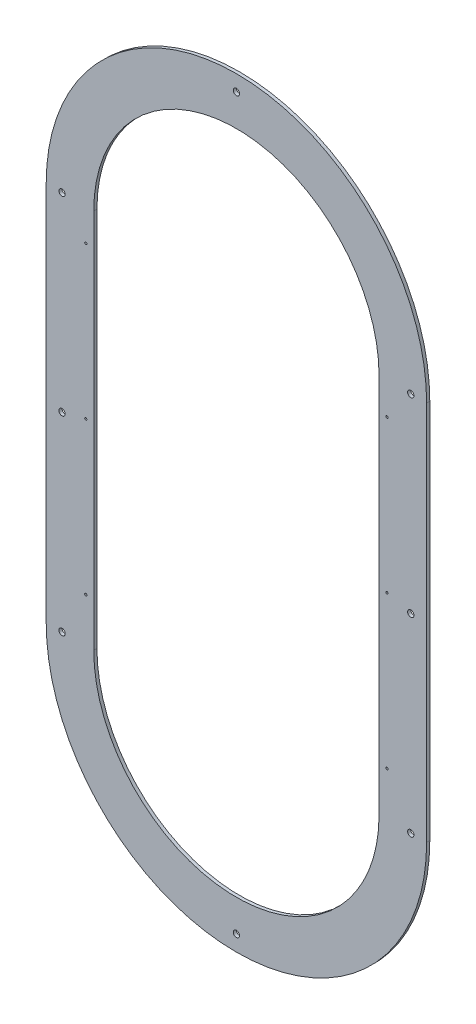
ISO-10303-21;
HEADER;
FILE_DESCRIPTION(('STEP AP214'),'2;1');
FILE_NAME('part.step','',(''),(''),'','','');
FILE_SCHEMA(('AUTOMOTIVE_DESIGN { 1 0 10303 214 1 1 1 1 }'));
ENDSEC;
DATA;
#1=APPLICATION_CONTEXT('core data for automotive mechanical design processes');
#2=APPLICATION_PROTOCOL_DEFINITION('international standard','automotive_design',2000,#1);
#3=PRODUCT_CONTEXT('',#1,'mechanical');
#4=PRODUCT('Part','Part','',(#3));
#5=PRODUCT_RELATED_PRODUCT_CATEGORY('part','',(#4));
#6=PRODUCT_DEFINITION_FORMATION('','',#4);
#7=PRODUCT_DEFINITION_CONTEXT('part definition',#1,'design');
#8=PRODUCT_DEFINITION('design','',#6,#7);
#9=PRODUCT_DEFINITION_SHAPE('','',#8);
#10=(LENGTH_UNIT() NAMED_UNIT(*) SI_UNIT(.MILLI.,.METRE.));
#11=(NAMED_UNIT(*) PLANE_ANGLE_UNIT() SI_UNIT($,.RADIAN.));
#12=(NAMED_UNIT(*) SI_UNIT($,.STERADIAN.) SOLID_ANGLE_UNIT());
#13=UNCERTAINTY_MEASURE_WITH_UNIT(LENGTH_MEASURE(1.E-05),#10,'distance_accuracy_value','');
#14=(GEOMETRIC_REPRESENTATION_CONTEXT(3) GLOBAL_UNCERTAINTY_ASSIGNED_CONTEXT((#13)) GLOBAL_UNIT_ASSIGNED_CONTEXT((#10,
#11,#12)) REPRESENTATION_CONTEXT('',''));
#15=CARTESIAN_POINT('',(0.,0.,0.));
#16=DIRECTION('',(0.,0.,1.));
#17=DIRECTION('',(1.,0.,0.));
#18=AXIS2_PLACEMENT_3D('',#15,#16,#17);
#19=CARTESIAN_POINT('',(0.,600.,0.));
#20=DIRECTION('',(0.,0.,1.));
#21=DIRECTION('',(1.,0.,0.));
#22=AXIS2_PLACEMENT_3D('',#19,#20,#21);
#23=PLANE('',#22);
#24=CARTESIAN_POINT('',(-475.,-460.750000000099,0.));
#25=DIRECTION('',(0.,0.,-1.));
#26=DIRECTION('',(-1.,0.,0.));
#27=AXIS2_PLACEMENT_3D('',#24,#25,#26);
#28=CIRCLE('',#27,3.5);
#29=CARTESIAN_POINT('',(-478.5,-460.750000000099,0.));
#30=VERTEX_POINT('',#29);
#31=EDGE_CURVE('E356',#30,#30,#28,.T.);
#32=ORIENTED_EDGE('',*,*,#31,.T.);
#33=EDGE_LOOP('',(#32));
#34=FACE_BOUND('',#33,.T.);
#35=CARTESIAN_POINT('',(474.999999999999,19.2499999999004,0.));
#36=DIRECTION('',(0.,0.,-1.));
#37=DIRECTION('',(-1.,0.,0.));
#38=AXIS2_PLACEMENT_3D('',#35,#36,#37);
#39=CIRCLE('',#38,3.5);
#40=CARTESIAN_POINT('',(471.499999999999,19.2499999999004,0.));
#41=VERTEX_POINT('',#40);
#42=EDGE_CURVE('E367',#41,#41,#39,.T.);
#43=ORIENTED_EDGE('',*,*,#42,.T.);
#44=EDGE_LOOP('',(#43));
#45=FACE_BOUND('',#44,.T.);
#46=CARTESIAN_POINT('',(474.999999999999,499.249999999901,0.));
#47=DIRECTION('',(0.,0.,-1.));
#48=DIRECTION('',(-1.,0.,0.));
#49=AXIS2_PLACEMENT_3D('',#46,#47,#48);
#50=CIRCLE('',#49,3.5);
#51=CARTESIAN_POINT('',(471.499999999999,499.249999999901,0.));
#52=VERTEX_POINT('',#51);
#53=EDGE_CURVE('E379',#52,#52,#50,.T.);
#54=ORIENTED_EDGE('',*,*,#53,.T.);
#55=EDGE_LOOP('',(#54));
#56=FACE_BOUND('',#55,.T.);
#57=CARTESIAN_POINT('',(475.,-460.750000000099,0.));
#58=DIRECTION('',(0.,0.,-1.));
#59=DIRECTION('',(-1.,0.,0.));
#60=AXIS2_PLACEMENT_3D('',#57,#58,#59);
#61=CIRCLE('',#60,3.5);
#62=CARTESIAN_POINT('',(471.5,-460.750000000099,0.));
#63=VERTEX_POINT('',#62);
#64=EDGE_CURVE('E391',#63,#63,#61,.T.);
#65=ORIENTED_EDGE('',*,*,#64,.T.);
#66=EDGE_LOOP('',(#65));
#67=FACE_BOUND('',#66,.T.);
#68=CARTESIAN_POINT('',(-1.01033360929657E-13,-1150.,0.));
#69=DIRECTION('',(0.,0.,1.));
#70=DIRECTION('',(1.,0.,0.));
#71=AXIS2_PLACEMENT_3D('',#68,#69,#70);
#72=CIRCLE('',#71,10.);
#73=CARTESIAN_POINT('',(9.9999999999999,-1150.,0.));
#74=VERTEX_POINT('',#73);
#75=EDGE_CURVE('E394',#74,#74,#72,.T.);
#76=ORIENTED_EDGE('',*,*,#75,.F.);
#77=EDGE_LOOP('',(#76));
#78=FACE_BOUND('',#77,.T.);
#79=CARTESIAN_POINT('',(550.,-600.,0.));
#80=DIRECTION('',(0.,0.,1.));
#81=DIRECTION('',(1.,0.,0.));
#82=AXIS2_PLACEMENT_3D('',#79,#80,#81);
#83=CIRCLE('',#82,9.99999999999998);
#84=CARTESIAN_POINT('',(560.,-600.,0.));
#85=VERTEX_POINT('',#84);
#86=EDGE_CURVE('E398',#85,#85,#83,.T.);
#87=ORIENTED_EDGE('',*,*,#86,.F.);
#88=EDGE_LOOP('',(#87));
#89=FACE_BOUND('',#88,.T.);
#90=CARTESIAN_POINT('',(550.,2.22044604925031E-13,0.));
#91=DIRECTION('',(0.,0.,1.));
#92=DIRECTION('',(1.,0.,0.));
#93=AXIS2_PLACEMENT_3D('',#90,#91,#92);
#94=CIRCLE('',#93,9.99999999999998);
#95=CARTESIAN_POINT('',(560.,2.22044604925031E-13,0.));
#96=VERTEX_POINT('',#95);
#97=EDGE_CURVE('E404',#96,#96,#94,.T.);
#98=ORIENTED_EDGE('',*,*,#97,.F.);
#99=EDGE_LOOP('',(#98));
#100=FACE_BOUND('',#99,.T.);
#101=CARTESIAN_POINT('',(550.,600.,0.));
#102=DIRECTION('',(0.,0.,1.));
#103=DIRECTION('',(1.,0.,0.));
#104=AXIS2_PLACEMENT_3D('',#101,#102,#103);
#105=CIRCLE('',#104,9.99999999999998);
#106=CARTESIAN_POINT('',(560.,600.,0.));
#107=VERTEX_POINT('',#106);
#108=EDGE_CURVE('E410',#107,#107,#105,.T.);
#109=ORIENTED_EDGE('',*,*,#108,.F.);
#110=EDGE_LOOP('',(#109));
#111=FACE_BOUND('',#110,.T.);
#112=CARTESIAN_POINT('',(-550.,-600.,0.));
#113=DIRECTION('',(0.,0.,1.));
#114=DIRECTION('',(1.,0.,0.));
#115=AXIS2_PLACEMENT_3D('',#112,#113,#114);
#116=CIRCLE('',#115,9.99999999999998);
#117=CARTESIAN_POINT('',(-540.,-600.,0.));
#118=VERTEX_POINT('',#117);
#119=EDGE_CURVE('E416',#118,#118,#116,.T.);
#120=ORIENTED_EDGE('',*,*,#119,.F.);
#121=EDGE_LOOP('',(#120));
#122=FACE_BOUND('',#121,.T.);
#123=CARTESIAN_POINT('',(-550.,1.11022302462516E-13,0.));
#124=DIRECTION('',(0.,0.,1.));
#125=DIRECTION('',(1.,0.,0.));
#126=AXIS2_PLACEMENT_3D('',#123,#124,#125);
#127=CIRCLE('',#126,9.99999999999998);
#128=CARTESIAN_POINT('',(-540.,1.11022302462516E-13,0.));
#129=VERTEX_POINT('',#128);
#130=EDGE_CURVE('E422',#129,#129,#127,.T.);
#131=ORIENTED_EDGE('',*,*,#130,.F.);
#132=EDGE_LOOP('',(#131));
#133=FACE_BOUND('',#132,.T.);
#134=CARTESIAN_POINT('',(-550.,600.,0.));
#135=DIRECTION('',(0.,0.,1.));
#136=DIRECTION('',(1.,0.,0.));
#137=AXIS2_PLACEMENT_3D('',#134,#135,#136);
#138=CIRCLE('',#137,9.99999999999998);
#139=CARTESIAN_POINT('',(-540.,600.,0.));
#140=VERTEX_POINT('',#139);
#141=EDGE_CURVE('E428',#140,#140,#138,.T.);
#142=ORIENTED_EDGE('',*,*,#141,.F.);
#143=EDGE_LOOP('',(#142));
#144=FACE_BOUND('',#143,.T.);
#145=CARTESIAN_POINT('',(0.,1150.,0.));
#146=DIRECTION('',(0.,0.,1.));
#147=DIRECTION('',(1.,0.,0.));
#148=AXIS2_PLACEMENT_3D('',#145,#146,#147);
#149=CIRCLE('',#148,10.);
#150=CARTESIAN_POINT('',(10.,1150.,0.));
#151=VERTEX_POINT('',#150);
#152=EDGE_CURVE('E126',#151,#151,#149,.T.);
#153=ORIENTED_EDGE('',*,*,#152,.F.);
#154=EDGE_LOOP('',(#153));
#155=FACE_BOUND('',#154,.T.);
#156=CARTESIAN_POINT('',(0.,-600.,0.));
#157=DIRECTION('',(0.,0.,1.));
#158=DIRECTION('',(1.,0.,0.));
#159=AXIS2_PLACEMENT_3D('',#156,#157,#158);
#160=CIRCLE('',#159,450.);
#161=CARTESIAN_POINT('',(-450.,-600.,0.));
#162=VERTEX_POINT('',#161);
#163=CARTESIAN_POINT('',(450.,-600.,0.));
#164=VERTEX_POINT('',#163);
#165=EDGE_CURVE('E61',#162,#164,#160,.T.);
#166=ORIENTED_EDGE('',*,*,#165,.F.);
#167=DIRECTION('',(0.,-1.,0.));
#168=VECTOR('',#167,1.);
#169=CARTESIAN_POINT('',(-450.,-600.,0.));
#170=LINE('',#169,#168);
#171=CARTESIAN_POINT('',(-450.,600.,0.));
#172=VERTEX_POINT('',#171);
#173=EDGE_CURVE('E120',#172,#162,#170,.T.);
#174=ORIENTED_EDGE('',*,*,#173,.F.);
#175=CARTESIAN_POINT('',(0.,600.,0.));
#176=DIRECTION('',(0.,0.,1.));
#177=DIRECTION('',(1.,0.,0.));
#178=AXIS2_PLACEMENT_3D('',#175,#176,#177);
#179=CIRCLE('',#178,450.);
#180=CARTESIAN_POINT('',(450.,600.,0.));
#181=VERTEX_POINT('',#180);
#182=EDGE_CURVE('E123',#181,#172,#179,.T.);
#183=ORIENTED_EDGE('',*,*,#182,.F.);
#184=DIRECTION('',(0.,1.,0.));
#185=VECTOR('',#184,1.);
#186=CARTESIAN_POINT('',(450.,-600.,0.));
#187=LINE('',#186,#185);
#188=EDGE_CURVE('E132',#164,#181,#187,.T.);
#189=ORIENTED_EDGE('',*,*,#188,.F.);
#190=EDGE_LOOP('',(#166,#174,#183,#189));
#191=FACE_BOUND('',#190,.T.);
#192=CARTESIAN_POINT('',(0.,600.,0.));
#193=DIRECTION('',(0.,0.,1.));
#194=DIRECTION('',(1.,0.,0.));
#195=AXIS2_PLACEMENT_3D('',#192,#193,#194);
#196=CIRCLE('',#195,600.);
#197=CARTESIAN_POINT('',(600.,600.,0.));
#198=VERTEX_POINT('',#197);
#199=CARTESIAN_POINT('',(-600.,600.,0.));
#200=VERTEX_POINT('',#199);
#201=EDGE_CURVE('E139',#198,#200,#196,.T.);
#202=ORIENTED_EDGE('',*,*,#201,.T.);
#203=DIRECTION('',(0.,-1.,0.));
#204=VECTOR('',#203,1.);
#205=CARTESIAN_POINT('',(-600.,-600.,0.));
#206=LINE('',#205,#204);
#207=CARTESIAN_POINT('',(-600.,-600.,0.));
#208=VERTEX_POINT('',#207);
#209=EDGE_CURVE('E158',#200,#208,#206,.T.);
#210=ORIENTED_EDGE('',*,*,#209,.T.);
#211=CARTESIAN_POINT('',(0.,-600.,0.));
#212=DIRECTION('',(0.,0.,1.));
#213=DIRECTION('',(1.,0.,0.));
#214=AXIS2_PLACEMENT_3D('',#211,#212,#213);
#215=CIRCLE('',#214,600.);
#216=CARTESIAN_POINT('',(600.,-600.,0.));
#217=VERTEX_POINT('',#216);
#218=EDGE_CURVE('E161',#208,#217,#215,.T.);
#219=ORIENTED_EDGE('',*,*,#218,.T.);
#220=DIRECTION('',(0.,1.,0.));
#221=VECTOR('',#220,1.);
#222=CARTESIAN_POINT('',(600.,-600.,0.));
#223=LINE('',#222,#221);
#224=EDGE_CURVE('E147',#217,#198,#223,.T.);
#225=ORIENTED_EDGE('',*,*,#224,.T.);
#226=EDGE_LOOP('',(#202,#210,#219,#225));
#227=FACE_BOUND('',#226,.T.);
#228=CARTESIAN_POINT('',(-474.999999999999,499.249999999901,0.));
#229=DIRECTION('',(0.,0.,-1.));
#230=DIRECTION('',(-1.,0.,0.));
#231=AXIS2_PLACEMENT_3D('',#228,#229,#230);
#232=CIRCLE('',#231,3.5);
#233=CARTESIAN_POINT('',(-478.499999999999,499.249999999901,0.));
#234=VERTEX_POINT('',#233);
#235=EDGE_CURVE('E344',#234,#234,#232,.T.);
#236=ORIENTED_EDGE('',*,*,#235,.T.);
#237=EDGE_LOOP('',(#236));
#238=FACE_BOUND('',#237,.T.);
#239=CARTESIAN_POINT('',(-474.999999999999,19.2499999999004,0.));
#240=DIRECTION('',(0.,0.,-1.));
#241=DIRECTION('',(-1.,0.,0.));
#242=AXIS2_PLACEMENT_3D('',#239,#240,#241);
#243=CIRCLE('',#242,3.5);
#244=CARTESIAN_POINT('',(-478.499999999999,19.2499999999004,0.));
#245=VERTEX_POINT('',#244);
#246=EDGE_CURVE('E332',#245,#245,#243,.T.);
#247=ORIENTED_EDGE('',*,*,#246,.T.);
#248=EDGE_LOOP('',(#247));
#249=FACE_BOUND('',#248,.T.);
#250=ADVANCED_FACE('F36',(#34,#45,#56,#67,#78,#89,#100,#111,#122,#133,#144,#155,#191,#227,#238,
#249),#23,.T.);
#251=CARTESIAN_POINT('',(0.,600.,-10.));
#252=DIRECTION('',(0.,0.,1.));
#253=DIRECTION('',(1.,0.,0.));
#254=AXIS2_PLACEMENT_3D('',#251,#252,#253);
#255=CYLINDRICAL_SURFACE('',#254,600.);
#256=ORIENTED_EDGE('',*,*,#201,.F.);
#257=DIRECTION('',(0.,0.,1.));
#258=VECTOR('',#257,1.);
#259=CARTESIAN_POINT('',(600.,600.,-10.));
#260=LINE('',#259,#258);
#261=CARTESIAN_POINT('',(600.,600.,-10.));
#262=VERTEX_POINT('',#261);
#263=EDGE_CURVE('E11',#262,#198,#260,.T.);
#264=ORIENTED_EDGE('',*,*,#263,.F.);
#265=CARTESIAN_POINT('',(0.,600.,-10.));
#266=DIRECTION('',(0.,0.,1.));
#267=DIRECTION('',(1.,0.,0.));
#268=AXIS2_PLACEMENT_3D('',#265,#266,#267);
#269=CIRCLE('',#268,600.);
#270=CARTESIAN_POINT('',(-600.,600.,-10.));
#271=VERTEX_POINT('',#270);
#272=EDGE_CURVE('E143',#262,#271,#269,.T.);
#273=ORIENTED_EDGE('',*,*,#272,.T.);
#274=DIRECTION('',(0.,0.,1.));
#275=VECTOR('',#274,1.);
#276=CARTESIAN_POINT('',(-600.,600.,-10.));
#277=LINE('',#276,#275);
#278=EDGE_CURVE('E40',#271,#200,#277,.T.);
#279=ORIENTED_EDGE('',*,*,#278,.T.);
#280=EDGE_LOOP('',(#256,#264,#273,#279));
#281=FACE_BOUND('',#280,.T.);
#282=ADVANCED_FACE('F38',(#281),#255,.T.);
#283=CARTESIAN_POINT('',(600.,-600.,-10.));
#284=DIRECTION('',(1.,0.,0.));
#285=DIRECTION('',(0.,0.,-1.));
#286=AXIS2_PLACEMENT_3D('',#283,#284,#285);
#287=PLANE('',#286);
#288=ORIENTED_EDGE('',*,*,#224,.F.);
#289=DIRECTION('',(0.,0.,1.));
#290=VECTOR('',#289,1.);
#291=CARTESIAN_POINT('',(600.,-600.,-10.));
#292=LINE('',#291,#290);
#293=CARTESIAN_POINT('',(600.,-600.,-10.));
#294=VERTEX_POINT('',#293);
#295=EDGE_CURVE('E45',#294,#217,#292,.T.);
#296=ORIENTED_EDGE('',*,*,#295,.F.);
#297=DIRECTION('',(0.,1.,0.));
#298=VECTOR('',#297,1.);
#299=CARTESIAN_POINT('',(600.,-600.,-10.));
#300=LINE('',#299,#298);
#301=EDGE_CURVE('E153',#294,#262,#300,.T.);
#302=ORIENTED_EDGE('',*,*,#301,.T.);
#303=ORIENTED_EDGE('',*,*,#263,.T.);
#304=EDGE_LOOP('',(#288,#296,#302,#303));
#305=FACE_BOUND('',#304,.T.);
#306=ADVANCED_FACE('F179',(#305),#287,.T.);
#307=CARTESIAN_POINT('',(0.,-600.,-10.));
#308=DIRECTION('',(0.,0.,1.));
#309=DIRECTION('',(1.,0.,0.));
#310=AXIS2_PLACEMENT_3D('',#307,#308,#309);
#311=CYLINDRICAL_SURFACE('',#310,600.);
#312=ORIENTED_EDGE('',*,*,#218,.F.);
#313=DIRECTION('',(0.,0.,1.));
#314=VECTOR('',#313,1.);
#315=CARTESIAN_POINT('',(-600.,-600.,-10.));
#316=LINE('',#315,#314);
#317=CARTESIAN_POINT('',(-600.,-600.,-10.));
#318=VERTEX_POINT('',#317);
#319=EDGE_CURVE('E166',#318,#208,#316,.T.);
#320=ORIENTED_EDGE('',*,*,#319,.F.);
#321=CARTESIAN_POINT('',(0.,-600.,-10.));
#322=DIRECTION('',(0.,0.,1.));
#323=DIRECTION('',(1.,0.,0.));
#324=AXIS2_PLACEMENT_3D('',#321,#322,#323);
#325=CIRCLE('',#324,600.);
#326=EDGE_CURVE('E150',#318,#294,#325,.T.);
#327=ORIENTED_EDGE('',*,*,#326,.T.);
#328=ORIENTED_EDGE('',*,*,#295,.T.);
#329=EDGE_LOOP('',(#312,#320,#327,#328));
#330=FACE_BOUND('',#329,.T.);
#331=ADVANCED_FACE('F183',(#330),#311,.T.);
#332=CARTESIAN_POINT('',(-600.,-600.,-10.));
#333=DIRECTION('',(-1.,0.,0.));
#334=DIRECTION('',(0.,0.,1.));
#335=AXIS2_PLACEMENT_3D('',#332,#333,#334);
#336=PLANE('',#335);
#337=ORIENTED_EDGE('',*,*,#209,.F.);
#338=ORIENTED_EDGE('',*,*,#278,.F.);
#339=DIRECTION('',(0.,-1.,0.));
#340=VECTOR('',#339,1.);
#341=CARTESIAN_POINT('',(-600.,-600.,-10.));
#342=LINE('',#341,#340);
#343=EDGE_CURVE('E146',#271,#318,#342,.T.);
#344=ORIENTED_EDGE('',*,*,#343,.T.);
#345=ORIENTED_EDGE('',*,*,#319,.T.);
#346=EDGE_LOOP('',(#337,#338,#344,#345));
#347=FACE_BOUND('',#346,.T.);
#348=ADVANCED_FACE('F174',(#347),#336,.T.);
#349=CARTESIAN_POINT('',(0.,600.,-10.));
#350=DIRECTION('',(0.,0.,1.));
#351=DIRECTION('',(1.,0.,0.));
#352=AXIS2_PLACEMENT_3D('',#349,#350,#351);
#353=PLANE('',#352);
#354=CARTESIAN_POINT('',(-474.999999999999,19.2499999999004,-10.));
#355=DIRECTION('',(0.,0.,-1.));
#356=DIRECTION('',(-1.,0.,0.));
#357=AXIS2_PLACEMENT_3D('',#354,#355,#356);
#358=CIRCLE('',#357,5.);
#359=CARTESIAN_POINT('',(-479.999999999999,19.2499999999004,-10.));
#360=VERTEX_POINT('',#359);
#361=EDGE_CURVE('E325',#360,#360,#358,.T.);
#362=ORIENTED_EDGE('',*,*,#361,.F.);
#363=EDGE_LOOP('',(#362));
#364=FACE_BOUND('',#363,.T.);
#365=CARTESIAN_POINT('',(-474.999999999999,499.249999999901,-10.));
#366=DIRECTION('',(0.,0.,-1.));
#367=DIRECTION('',(-1.,0.,0.));
#368=AXIS2_PLACEMENT_3D('',#365,#366,#367);
#369=CIRCLE('',#368,5.);
#370=CARTESIAN_POINT('',(-479.999999999999,499.249999999901,-10.));
#371=VERTEX_POINT('',#370);
#372=EDGE_CURVE('E335',#371,#371,#369,.T.);
#373=ORIENTED_EDGE('',*,*,#372,.F.);
#374=EDGE_LOOP('',(#373));
#375=FACE_BOUND('',#374,.T.);
#376=CARTESIAN_POINT('',(-475.,-460.750000000099,-10.));
#377=DIRECTION('',(0.,0.,-1.));
#378=DIRECTION('',(-1.,0.,0.));
#379=AXIS2_PLACEMENT_3D('',#376,#377,#378);
#380=CIRCLE('',#379,5.);
#381=CARTESIAN_POINT('',(-480.,-460.750000000099,-10.));
#382=VERTEX_POINT('',#381);
#383=EDGE_CURVE('E347',#382,#382,#380,.T.);
#384=ORIENTED_EDGE('',*,*,#383,.F.);
#385=EDGE_LOOP('',(#384));
#386=FACE_BOUND('',#385,.T.);
#387=CARTESIAN_POINT('',(474.999999999999,19.2499999999004,-10.));
#388=DIRECTION('',(0.,0.,-1.));
#389=DIRECTION('',(-1.,0.,0.));
#390=AXIS2_PLACEMENT_3D('',#387,#388,#389);
#391=CIRCLE('',#390,5.);
#392=CARTESIAN_POINT('',(469.999999999999,19.2499999999004,-10.));
#393=VERTEX_POINT('',#392);
#394=EDGE_CURVE('E358',#393,#393,#391,.T.);
#395=ORIENTED_EDGE('',*,*,#394,.F.);
#396=EDGE_LOOP('',(#395));
#397=FACE_BOUND('',#396,.T.);
#398=CARTESIAN_POINT('',(474.999999999999,499.249999999901,-10.));
#399=DIRECTION('',(0.,0.,-1.));
#400=DIRECTION('',(-1.,0.,0.));
#401=AXIS2_PLACEMENT_3D('',#398,#399,#400);
#402=CIRCLE('',#401,5.);
#403=CARTESIAN_POINT('',(469.999999999999,499.249999999901,-10.));
#404=VERTEX_POINT('',#403);
#405=EDGE_CURVE('E370',#404,#404,#402,.T.);
#406=ORIENTED_EDGE('',*,*,#405,.F.);
#407=EDGE_LOOP('',(#406));
#408=FACE_BOUND('',#407,.T.);
#409=CARTESIAN_POINT('',(475.,-460.750000000099,-10.));
#410=DIRECTION('',(0.,0.,-1.));
#411=DIRECTION('',(-1.,0.,0.));
#412=AXIS2_PLACEMENT_3D('',#409,#410,#411);
#413=CIRCLE('',#412,5.);
#414=CARTESIAN_POINT('',(470.,-460.750000000099,-10.));
#415=VERTEX_POINT('',#414);
#416=EDGE_CURVE('E382',#415,#415,#413,.T.);
#417=ORIENTED_EDGE('',*,*,#416,.F.);
#418=EDGE_LOOP('',(#417));
#419=FACE_BOUND('',#418,.T.);
#420=CARTESIAN_POINT('',(-1.01033360929657E-13,-1150.,-10.));
#421=DIRECTION('',(0.,0.,1.));
#422=DIRECTION('',(1.,0.,0.));
#423=AXIS2_PLACEMENT_3D('',#420,#421,#422);
#424=CIRCLE('',#423,10.);
#425=CARTESIAN_POINT('',(9.9999999999999,-1150.,-10.));
#426=VERTEX_POINT('',#425);
#427=EDGE_CURVE('E395',#426,#426,#424,.T.);
#428=ORIENTED_EDGE('',*,*,#427,.T.);
#429=EDGE_LOOP('',(#428));
#430=FACE_BOUND('',#429,.T.);
#431=CARTESIAN_POINT('',(550.,-600.,-10.));
#432=DIRECTION('',(0.,0.,1.));
#433=DIRECTION('',(1.,0.,0.));
#434=AXIS2_PLACEMENT_3D('',#431,#432,#433);
#435=CIRCLE('',#434,9.99999999999998);
#436=CARTESIAN_POINT('',(560.,-600.,-10.));
#437=VERTEX_POINT('',#436);
#438=EDGE_CURVE('E401',#437,#437,#435,.T.);
#439=ORIENTED_EDGE('',*,*,#438,.T.);
#440=EDGE_LOOP('',(#439));
#441=FACE_BOUND('',#440,.T.);
#442=CARTESIAN_POINT('',(550.,2.22044604925031E-13,-10.));
#443=DIRECTION('',(0.,0.,1.));
#444=DIRECTION('',(1.,0.,0.));
#445=AXIS2_PLACEMENT_3D('',#442,#443,#444);
#446=CIRCLE('',#445,9.99999999999998);
#447=CARTESIAN_POINT('',(560.,2.22044604925031E-13,-10.));
#448=VERTEX_POINT('',#447);
#449=EDGE_CURVE('E407',#448,#448,#446,.T.);
#450=ORIENTED_EDGE('',*,*,#449,.T.);
#451=EDGE_LOOP('',(#450));
#452=FACE_BOUND('',#451,.T.);
#453=CARTESIAN_POINT('',(550.,600.,-10.));
#454=DIRECTION('',(0.,0.,1.));
#455=DIRECTION('',(1.,0.,0.));
#456=AXIS2_PLACEMENT_3D('',#453,#454,#455);
#457=CIRCLE('',#456,9.99999999999998);
#458=CARTESIAN_POINT('',(560.,600.,-10.));
#459=VERTEX_POINT('',#458);
#460=EDGE_CURVE('E413',#459,#459,#457,.T.);
#461=ORIENTED_EDGE('',*,*,#460,.T.);
#462=EDGE_LOOP('',(#461));
#463=FACE_BOUND('',#462,.T.);
#464=CARTESIAN_POINT('',(-550.,-600.,-10.));
#465=DIRECTION('',(0.,0.,1.));
#466=DIRECTION('',(1.,0.,0.));
#467=AXIS2_PLACEMENT_3D('',#464,#465,#466);
#468=CIRCLE('',#467,9.99999999999998);
#469=CARTESIAN_POINT('',(-540.,-600.,-10.));
#470=VERTEX_POINT('',#469);
#471=EDGE_CURVE('E419',#470,#470,#468,.T.);
#472=ORIENTED_EDGE('',*,*,#471,.T.);
#473=EDGE_LOOP('',(#472));
#474=FACE_BOUND('',#473,.T.);
#475=CARTESIAN_POINT('',(-550.,1.11022302462516E-13,-10.));
#476=DIRECTION('',(0.,0.,1.));
#477=DIRECTION('',(1.,0.,0.));
#478=AXIS2_PLACEMENT_3D('',#475,#476,#477);
#479=CIRCLE('',#478,9.99999999999998);
#480=CARTESIAN_POINT('',(-540.,1.11022302462516E-13,-10.));
#481=VERTEX_POINT('',#480);
#482=EDGE_CURVE('E425',#481,#481,#479,.T.);
#483=ORIENTED_EDGE('',*,*,#482,.T.);
#484=EDGE_LOOP('',(#483));
#485=FACE_BOUND('',#484,.T.);
#486=CARTESIAN_POINT('',(-550.,600.,-10.));
#487=DIRECTION('',(0.,0.,1.));
#488=DIRECTION('',(1.,0.,0.));
#489=AXIS2_PLACEMENT_3D('',#486,#487,#488);
#490=CIRCLE('',#489,9.99999999999998);
#491=CARTESIAN_POINT('',(-540.,600.,-10.));
#492=VERTEX_POINT('',#491);
#493=EDGE_CURVE('E431',#492,#492,#490,.T.);
#494=ORIENTED_EDGE('',*,*,#493,.T.);
#495=EDGE_LOOP('',(#494));
#496=FACE_BOUND('',#495,.T.);
#497=CARTESIAN_POINT('',(0.,1150.,-10.));
#498=DIRECTION('',(0.,0.,1.));
#499=DIRECTION('',(1.,0.,0.));
#500=AXIS2_PLACEMENT_3D('',#497,#498,#499);
#501=CIRCLE('',#500,10.);
#502=CARTESIAN_POINT('',(10.,1150.,-10.));
#503=VERTEX_POINT('',#502);
#504=EDGE_CURVE('E133',#503,#503,#501,.T.);
#505=ORIENTED_EDGE('',*,*,#504,.T.);
#506=EDGE_LOOP('',(#505));
#507=FACE_BOUND('',#506,.T.);
#508=DIRECTION('',(0.,-1.,0.));
#509=VECTOR('',#508,1.);
#510=CARTESIAN_POINT('',(-450.,-600.,-10.));
#511=LINE('',#510,#509);
#512=CARTESIAN_POINT('',(-450.,600.,-10.));
#513=VERTEX_POINT('',#512);
#514=CARTESIAN_POINT('',(-450.,-600.,-10.));
#515=VERTEX_POINT('',#514);
#516=EDGE_CURVE('E110',#513,#515,#511,.T.);
#517=ORIENTED_EDGE('',*,*,#516,.T.);
#518=CARTESIAN_POINT('',(0.,-600.,-10.));
#519=DIRECTION('',(0.,0.,1.));
#520=DIRECTION('',(1.,0.,0.));
#521=AXIS2_PLACEMENT_3D('',#518,#519,#520);
#522=CIRCLE('',#521,450.);
#523=CARTESIAN_POINT('',(450.,-600.,-10.));
#524=VERTEX_POINT('',#523);
#525=EDGE_CURVE('E104',#515,#524,#522,.T.);
#526=ORIENTED_EDGE('',*,*,#525,.T.);
#527=DIRECTION('',(0.,1.,0.));
#528=VECTOR('',#527,1.);
#529=CARTESIAN_POINT('',(450.,-600.,-10.));
#530=LINE('',#529,#528);
#531=CARTESIAN_POINT('',(450.,600.,-10.));
#532=VERTEX_POINT('',#531);
#533=EDGE_CURVE('E113',#524,#532,#530,.T.);
#534=ORIENTED_EDGE('',*,*,#533,.T.);
#535=CARTESIAN_POINT('',(0.,600.,-10.));
#536=DIRECTION('',(0.,0.,1.));
#537=DIRECTION('',(1.,0.,0.));
#538=AXIS2_PLACEMENT_3D('',#535,#536,#537);
#539=CIRCLE('',#538,450.);
#540=EDGE_CURVE('E53',#532,#513,#539,.T.);
#541=ORIENTED_EDGE('',*,*,#540,.T.);
#542=EDGE_LOOP('',(#517,#526,#534,#541));
#543=FACE_BOUND('',#542,.T.);
#544=ORIENTED_EDGE('',*,*,#272,.F.);
#545=ORIENTED_EDGE('',*,*,#301,.F.);
#546=ORIENTED_EDGE('',*,*,#326,.F.);
#547=ORIENTED_EDGE('',*,*,#343,.F.);
#548=EDGE_LOOP('',(#544,#545,#546,#547));
#549=FACE_BOUND('',#548,.T.);
#550=ADVANCED_FACE('F117',(#364,#375,#386,#397,#408,#419,#430,#441,#452,#463,#474,#485,#496,
#507,#543,#549),#353,.F.);
#551=CARTESIAN_POINT('',(0.,-600.,-10.));
#552=DIRECTION('',(0.,0.,1.));
#553=DIRECTION('',(1.,0.,0.));
#554=AXIS2_PLACEMENT_3D('',#551,#552,#553);
#555=CYLINDRICAL_SURFACE('',#554,450.);
#556=ORIENTED_EDGE('',*,*,#165,.T.);
#557=DIRECTION('',(0.,0.,1.));
#558=VECTOR('',#557,1.);
#559=CARTESIAN_POINT('',(450.,-600.,-10.));
#560=LINE('',#559,#558);
#561=EDGE_CURVE('E100',#524,#164,#560,.T.);
#562=ORIENTED_EDGE('',*,*,#561,.F.);
#563=ORIENTED_EDGE('',*,*,#525,.F.);
#564=DIRECTION('',(0.,0.,1.));
#565=VECTOR('',#564,1.);
#566=CARTESIAN_POINT('',(-450.,-600.,-10.));
#567=LINE('',#566,#565);
#568=EDGE_CURVE('E137',#515,#162,#567,.T.);
#569=ORIENTED_EDGE('',*,*,#568,.T.);
#570=EDGE_LOOP('',(#556,#562,#563,#569));
#571=FACE_BOUND('',#570,.T.);
#572=ADVANCED_FACE('F102',(#571),#555,.F.);
#573=CARTESIAN_POINT('',(-450.,-600.,-10.));
#574=DIRECTION('',(-1.,0.,0.));
#575=DIRECTION('',(0.,0.,1.));
#576=AXIS2_PLACEMENT_3D('',#573,#574,#575);
#577=PLANE('',#576);
#578=ORIENTED_EDGE('',*,*,#173,.T.);
#579=ORIENTED_EDGE('',*,*,#568,.F.);
#580=ORIENTED_EDGE('',*,*,#516,.F.);
#581=DIRECTION('',(0.,0.,1.));
#582=VECTOR('',#581,1.);
#583=CARTESIAN_POINT('',(-450.,600.,-10.));
#584=LINE('',#583,#582);
#585=EDGE_CURVE('E140',#513,#172,#584,.T.);
#586=ORIENTED_EDGE('',*,*,#585,.T.);
#587=EDGE_LOOP('',(#578,#579,#580,#586));
#588=FACE_BOUND('',#587,.T.);
#589=ADVANCED_FACE('F205',(#588),#577,.F.);
#590=CARTESIAN_POINT('',(0.,600.,-10.));
#591=DIRECTION('',(0.,0.,1.));
#592=DIRECTION('',(1.,0.,0.));
#593=AXIS2_PLACEMENT_3D('',#590,#591,#592);
#594=CYLINDRICAL_SURFACE('',#593,450.);
#595=ORIENTED_EDGE('',*,*,#182,.T.);
#596=ORIENTED_EDGE('',*,*,#585,.F.);
#597=ORIENTED_EDGE('',*,*,#540,.F.);
#598=DIRECTION('',(0.,0.,1.));
#599=VECTOR('',#598,1.);
#600=CARTESIAN_POINT('',(450.,600.,-10.));
#601=LINE('',#600,#599);
#602=EDGE_CURVE('E109',#532,#181,#601,.T.);
#603=ORIENTED_EDGE('',*,*,#602,.T.);
#604=EDGE_LOOP('',(#595,#596,#597,#603));
#605=FACE_BOUND('',#604,.T.);
#606=ADVANCED_FACE('F209',(#605),#594,.F.);
#607=CARTESIAN_POINT('',(450.,-600.,-10.));
#608=DIRECTION('',(1.,0.,0.));
#609=DIRECTION('',(0.,0.,-1.));
#610=AXIS2_PLACEMENT_3D('',#607,#608,#609);
#611=PLANE('',#610);
#612=ORIENTED_EDGE('',*,*,#188,.T.);
#613=ORIENTED_EDGE('',*,*,#602,.F.);
#614=ORIENTED_EDGE('',*,*,#533,.F.);
#615=ORIENTED_EDGE('',*,*,#561,.T.);
#616=EDGE_LOOP('',(#612,#613,#614,#615));
#617=FACE_BOUND('',#616,.T.);
#618=ADVANCED_FACE('F114',(#617),#611,.F.);
#619=CARTESIAN_POINT('',(0.,1150.,-10.));
#620=DIRECTION('',(0.,0.,1.));
#621=DIRECTION('',(1.,0.,0.));
#622=AXIS2_PLACEMENT_3D('',#619,#620,#621);
#623=CYLINDRICAL_SURFACE('',#622,10.);
#624=ORIENTED_EDGE('',*,*,#504,.F.);
#625=EDGE_LOOP('',(#624));
#626=FACE_BOUND('',#625,.T.);
#627=ORIENTED_EDGE('',*,*,#152,.T.);
#628=EDGE_LOOP('',(#627));
#629=FACE_BOUND('',#628,.T.);
#630=ADVANCED_FACE('F208',(#626,#629),#623,.F.);
#631=CARTESIAN_POINT('',(-550.,600.,-10.));
#632=DIRECTION('',(0.,0.,1.));
#633=DIRECTION('',(1.,0.,0.));
#634=AXIS2_PLACEMENT_3D('',#631,#632,#633);
#635=CYLINDRICAL_SURFACE('',#634,9.99999999999998);
#636=ORIENTED_EDGE('',*,*,#493,.F.);
#637=EDGE_LOOP('',(#636));
#638=FACE_BOUND('',#637,.T.);
#639=ORIENTED_EDGE('',*,*,#141,.T.);
#640=EDGE_LOOP('',(#639));
#641=FACE_BOUND('',#640,.T.);
#642=ADVANCED_FACE('F217',(#638,#641),#635,.F.);
#643=CARTESIAN_POINT('',(-550.,1.11022302462516E-13,-10.));
#644=DIRECTION('',(0.,0.,1.));
#645=DIRECTION('',(1.,0.,0.));
#646=AXIS2_PLACEMENT_3D('',#643,#644,#645);
#647=CYLINDRICAL_SURFACE('',#646,9.99999999999998);
#648=ORIENTED_EDGE('',*,*,#482,.F.);
#649=EDGE_LOOP('',(#648));
#650=FACE_BOUND('',#649,.T.);
#651=ORIENTED_EDGE('',*,*,#130,.T.);
#652=EDGE_LOOP('',(#651));
#653=FACE_BOUND('',#652,.T.);
#654=ADVANCED_FACE('F221',(#650,#653),#647,.F.);
#655=CARTESIAN_POINT('',(-550.,-600.,-10.));
#656=DIRECTION('',(0.,0.,1.));
#657=DIRECTION('',(1.,0.,0.));
#658=AXIS2_PLACEMENT_3D('',#655,#656,#657);
#659=CYLINDRICAL_SURFACE('',#658,9.99999999999998);
#660=ORIENTED_EDGE('',*,*,#471,.F.);
#661=EDGE_LOOP('',(#660));
#662=FACE_BOUND('',#661,.T.);
#663=ORIENTED_EDGE('',*,*,#119,.T.);
#664=EDGE_LOOP('',(#663));
#665=FACE_BOUND('',#664,.T.);
#666=ADVANCED_FACE('F225',(#662,#665),#659,.F.);
#667=CARTESIAN_POINT('',(550.,600.,-10.));
#668=DIRECTION('',(0.,0.,1.));
#669=DIRECTION('',(1.,0.,0.));
#670=AXIS2_PLACEMENT_3D('',#667,#668,#669);
#671=CYLINDRICAL_SURFACE('',#670,9.99999999999998);
#672=ORIENTED_EDGE('',*,*,#460,.F.);
#673=EDGE_LOOP('',(#672));
#674=FACE_BOUND('',#673,.T.);
#675=ORIENTED_EDGE('',*,*,#108,.T.);
#676=EDGE_LOOP('',(#675));
#677=FACE_BOUND('',#676,.T.);
#678=ADVANCED_FACE('F229',(#674,#677),#671,.F.);
#679=CARTESIAN_POINT('',(550.,2.22044604925031E-13,-10.));
#680=DIRECTION('',(0.,0.,1.));
#681=DIRECTION('',(1.,0.,0.));
#682=AXIS2_PLACEMENT_3D('',#679,#680,#681);
#683=CYLINDRICAL_SURFACE('',#682,9.99999999999998);
#684=ORIENTED_EDGE('',*,*,#449,.F.);
#685=EDGE_LOOP('',(#684));
#686=FACE_BOUND('',#685,.T.);
#687=ORIENTED_EDGE('',*,*,#97,.T.);
#688=EDGE_LOOP('',(#687));
#689=FACE_BOUND('',#688,.T.);
#690=ADVANCED_FACE('F233',(#686,#689),#683,.F.);
#691=CARTESIAN_POINT('',(550.,-600.,-10.));
#692=DIRECTION('',(0.,0.,1.));
#693=DIRECTION('',(1.,0.,0.));
#694=AXIS2_PLACEMENT_3D('',#691,#692,#693);
#695=CYLINDRICAL_SURFACE('',#694,9.99999999999998);
#696=ORIENTED_EDGE('',*,*,#438,.F.);
#697=EDGE_LOOP('',(#696));
#698=FACE_BOUND('',#697,.T.);
#699=ORIENTED_EDGE('',*,*,#86,.T.);
#700=EDGE_LOOP('',(#699));
#701=FACE_BOUND('',#700,.T.);
#702=ADVANCED_FACE('F237',(#698,#701),#695,.F.);
#703=CARTESIAN_POINT('',(-1.01033360929657E-13,-1150.,-10.));
#704=DIRECTION('',(0.,0.,1.));
#705=DIRECTION('',(1.,0.,0.));
#706=AXIS2_PLACEMENT_3D('',#703,#704,#705);
#707=CYLINDRICAL_SURFACE('',#706,10.);
#708=ORIENTED_EDGE('',*,*,#427,.F.);
#709=EDGE_LOOP('',(#708));
#710=FACE_BOUND('',#709,.T.);
#711=ORIENTED_EDGE('',*,*,#75,.T.);
#712=EDGE_LOOP('',(#711));
#713=FACE_BOUND('',#712,.T.);
#714=ADVANCED_FACE('F241',(#710,#713),#707,.F.);
#715=CARTESIAN_POINT('',(475.,-460.750000000099,-10.));
#716=DIRECTION('',(0.,0.,-1.));
#717=DIRECTION('',(-1.,0.,0.));
#718=AXIS2_PLACEMENT_3D('',#715,#716,#717);
#719=CYLINDRICAL_SURFACE('',#718,3.5);
#720=ORIENTED_EDGE('',*,*,#64,.F.);
#721=EDGE_LOOP('',(#720));
#722=FACE_BOUND('',#721,.T.);
#723=CARTESIAN_POINT('',(475.,-460.750000000099,-5.));
#724=DIRECTION('',(0.,0.,-1.));
#725=DIRECTION('',(-1.,0.,0.));
#726=AXIS2_PLACEMENT_3D('',#723,#724,#725);
#727=CIRCLE('',#726,3.5);
#728=CARTESIAN_POINT('',(471.5,-460.750000000099,-5.));
#729=VERTEX_POINT('',#728);
#730=EDGE_CURVE('E388',#729,#729,#727,.T.);
#731=ORIENTED_EDGE('',*,*,#730,.T.);
#732=EDGE_LOOP('',(#731));
#733=FACE_BOUND('',#732,.T.);
#734=ADVANCED_FACE('F245',(#722,#733),#719,.F.);
#735=CARTESIAN_POINT('',(478.5,-460.750000000099,-5.));
#736=DIRECTION('',(0.,0.,1.));
#737=DIRECTION('',(1.,0.,0.));
#738=AXIS2_PLACEMENT_3D('',#735,#736,#737);
#739=PLANE('',#738);
#740=ORIENTED_EDGE('',*,*,#730,.F.);
#741=EDGE_LOOP('',(#740));
#742=FACE_BOUND('',#741,.T.);
#743=CARTESIAN_POINT('',(475.,-460.750000000099,-5.));
#744=DIRECTION('',(0.,0.,-1.));
#745=DIRECTION('',(-1.,0.,0.));
#746=AXIS2_PLACEMENT_3D('',#743,#744,#745);
#747=CIRCLE('',#746,5.);
#748=CARTESIAN_POINT('',(470.,-460.750000000099,-5.));
#749=VERTEX_POINT('',#748);
#750=EDGE_CURVE('E385',#749,#749,#747,.T.);
#751=ORIENTED_EDGE('',*,*,#750,.T.);
#752=EDGE_LOOP('',(#751));
#753=FACE_BOUND('',#752,.T.);
#754=ADVANCED_FACE('F249',(#742,#753),#739,.F.);
#755=CARTESIAN_POINT('',(475.,-460.750000000099,-10.));
#756=DIRECTION('',(0.,0.,-1.));
#757=DIRECTION('',(-1.,0.,0.));
#758=AXIS2_PLACEMENT_3D('',#755,#756,#757);
#759=CYLINDRICAL_SURFACE('',#758,5.);
#760=ORIENTED_EDGE('',*,*,#750,.F.);
#761=EDGE_LOOP('',(#760));
#762=FACE_BOUND('',#761,.T.);
#763=ORIENTED_EDGE('',*,*,#416,.T.);
#764=EDGE_LOOP('',(#763));
#765=FACE_BOUND('',#764,.T.);
#766=ADVANCED_FACE('F253',(#762,#765),#759,.F.);
#767=CARTESIAN_POINT('',(474.999999999999,499.249999999901,-10.));
#768=DIRECTION('',(0.,0.,-1.));
#769=DIRECTION('',(-1.,0.,0.));
#770=AXIS2_PLACEMENT_3D('',#767,#768,#769);
#771=CYLINDRICAL_SURFACE('',#770,3.5);
#772=ORIENTED_EDGE('',*,*,#53,.F.);
#773=EDGE_LOOP('',(#772));
#774=FACE_BOUND('',#773,.T.);
#775=CARTESIAN_POINT('',(474.999999999999,499.249999999901,-5.));
#776=DIRECTION('',(0.,0.,-1.));
#777=DIRECTION('',(-1.,0.,0.));
#778=AXIS2_PLACEMENT_3D('',#775,#776,#777);
#779=CIRCLE('',#778,3.5);
#780=CARTESIAN_POINT('',(471.499999999999,499.249999999901,-5.));
#781=VERTEX_POINT('',#780);
#782=EDGE_CURVE('E376',#781,#781,#779,.T.);
#783=ORIENTED_EDGE('',*,*,#782,.T.);
#784=EDGE_LOOP('',(#783));
#785=FACE_BOUND('',#784,.T.);
#786=ADVANCED_FACE('F257',(#774,#785),#771,.F.);
#787=CARTESIAN_POINT('',(478.499999999999,499.249999999901,-5.));
#788=DIRECTION('',(0.,0.,1.));
#789=DIRECTION('',(1.,0.,0.));
#790=AXIS2_PLACEMENT_3D('',#787,#788,#789);
#791=PLANE('',#790);
#792=ORIENTED_EDGE('',*,*,#782,.F.);
#793=EDGE_LOOP('',(#792));
#794=FACE_BOUND('',#793,.T.);
#795=CARTESIAN_POINT('',(474.999999999999,499.249999999901,-5.));
#796=DIRECTION('',(0.,0.,-1.));
#797=DIRECTION('',(-1.,0.,0.));
#798=AXIS2_PLACEMENT_3D('',#795,#796,#797);
#799=CIRCLE('',#798,5.);
#800=CARTESIAN_POINT('',(469.999999999999,499.249999999901,-5.));
#801=VERTEX_POINT('',#800);
#802=EDGE_CURVE('E373',#801,#801,#799,.T.);
#803=ORIENTED_EDGE('',*,*,#802,.T.);
#804=EDGE_LOOP('',(#803));
#805=FACE_BOUND('',#804,.T.);
#806=ADVANCED_FACE('F261',(#794,#805),#791,.F.);
#807=CARTESIAN_POINT('',(474.999999999999,499.249999999901,-10.));
#808=DIRECTION('',(0.,0.,-1.));
#809=DIRECTION('',(-1.,0.,0.));
#810=AXIS2_PLACEMENT_3D('',#807,#808,#809);
#811=CYLINDRICAL_SURFACE('',#810,5.);
#812=ORIENTED_EDGE('',*,*,#802,.F.);
#813=EDGE_LOOP('',(#812));
#814=FACE_BOUND('',#813,.T.);
#815=ORIENTED_EDGE('',*,*,#405,.T.);
#816=EDGE_LOOP('',(#815));
#817=FACE_BOUND('',#816,.T.);
#818=ADVANCED_FACE('F265',(#814,#817),#811,.F.);
#819=CARTESIAN_POINT('',(474.999999999999,19.2499999999004,-10.));
#820=DIRECTION('',(0.,0.,-1.));
#821=DIRECTION('',(-1.,0.,0.));
#822=AXIS2_PLACEMENT_3D('',#819,#820,#821);
#823=CYLINDRICAL_SURFACE('',#822,3.5);
#824=ORIENTED_EDGE('',*,*,#42,.F.);
#825=EDGE_LOOP('',(#824));
#826=FACE_BOUND('',#825,.T.);
#827=CARTESIAN_POINT('',(474.999999999999,19.2499999999004,-5.));
#828=DIRECTION('',(0.,0.,-1.));
#829=DIRECTION('',(-1.,0.,0.));
#830=AXIS2_PLACEMENT_3D('',#827,#828,#829);
#831=CIRCLE('',#830,3.5);
#832=CARTESIAN_POINT('',(471.499999999999,19.2499999999004,-5.));
#833=VERTEX_POINT('',#832);
#834=EDGE_CURVE('E364',#833,#833,#831,.T.);
#835=ORIENTED_EDGE('',*,*,#834,.T.);
#836=EDGE_LOOP('',(#835));
#837=FACE_BOUND('',#836,.T.);
#838=ADVANCED_FACE('F269',(#826,#837),#823,.F.);
#839=CARTESIAN_POINT('',(478.499999999999,19.2499999999004,-5.));
#840=DIRECTION('',(0.,0.,1.));
#841=DIRECTION('',(1.,0.,0.));
#842=AXIS2_PLACEMENT_3D('',#839,#840,#841);
#843=PLANE('',#842);
#844=ORIENTED_EDGE('',*,*,#834,.F.);
#845=EDGE_LOOP('',(#844));
#846=FACE_BOUND('',#845,.T.);
#847=CARTESIAN_POINT('',(474.999999999999,19.2499999999004,-5.));
#848=DIRECTION('',(0.,0.,-1.));
#849=DIRECTION('',(-1.,0.,0.));
#850=AXIS2_PLACEMENT_3D('',#847,#848,#849);
#851=CIRCLE('',#850,5.);
#852=CARTESIAN_POINT('',(469.999999999999,19.2499999999004,-5.));
#853=VERTEX_POINT('',#852);
#854=EDGE_CURVE('E361',#853,#853,#851,.T.);
#855=ORIENTED_EDGE('',*,*,#854,.T.);
#856=EDGE_LOOP('',(#855));
#857=FACE_BOUND('',#856,.T.);
#858=ADVANCED_FACE('F273',(#846,#857),#843,.F.);
#859=CARTESIAN_POINT('',(474.999999999999,19.2499999999004,-10.));
#860=DIRECTION('',(0.,0.,-1.));
#861=DIRECTION('',(-1.,0.,0.));
#862=AXIS2_PLACEMENT_3D('',#859,#860,#861);
#863=CYLINDRICAL_SURFACE('',#862,5.);
#864=ORIENTED_EDGE('',*,*,#854,.F.);
#865=EDGE_LOOP('',(#864));
#866=FACE_BOUND('',#865,.T.);
#867=ORIENTED_EDGE('',*,*,#394,.T.);
#868=EDGE_LOOP('',(#867));
#869=FACE_BOUND('',#868,.T.);
#870=ADVANCED_FACE('F277',(#866,#869),#863,.F.);
#871=CARTESIAN_POINT('',(-475.,-460.750000000099,-10.));
#872=DIRECTION('',(0.,0.,-1.));
#873=DIRECTION('',(-1.,0.,0.));
#874=AXIS2_PLACEMENT_3D('',#871,#872,#873);
#875=CYLINDRICAL_SURFACE('',#874,3.5);
#876=ORIENTED_EDGE('',*,*,#31,.F.);
#877=EDGE_LOOP('',(#876));
#878=FACE_BOUND('',#877,.T.);
#879=CARTESIAN_POINT('',(-475.,-460.750000000099,-5.));
#880=DIRECTION('',(0.,0.,-1.));
#881=DIRECTION('',(-1.,0.,0.));
#882=AXIS2_PLACEMENT_3D('',#879,#880,#881);
#883=CIRCLE('',#882,3.5);
#884=CARTESIAN_POINT('',(-478.5,-460.750000000099,-5.));
#885=VERTEX_POINT('',#884);
#886=EDGE_CURVE('E353',#885,#885,#883,.T.);
#887=ORIENTED_EDGE('',*,*,#886,.T.);
#888=EDGE_LOOP('',(#887));
#889=FACE_BOUND('',#888,.T.);
#890=ADVANCED_FACE('F281',(#878,#889),#875,.F.);
#891=CARTESIAN_POINT('',(-471.5,-460.750000000099,-5.));
#892=DIRECTION('',(0.,0.,1.));
#893=DIRECTION('',(1.,0.,0.));
#894=AXIS2_PLACEMENT_3D('',#891,#892,#893);
#895=PLANE('',#894);
#896=ORIENTED_EDGE('',*,*,#886,.F.);
#897=EDGE_LOOP('',(#896));
#898=FACE_BOUND('',#897,.T.);
#899=CARTESIAN_POINT('',(-475.,-460.750000000099,-5.));
#900=DIRECTION('',(0.,0.,-1.));
#901=DIRECTION('',(-1.,0.,0.));
#902=AXIS2_PLACEMENT_3D('',#899,#900,#901);
#903=CIRCLE('',#902,5.);
#904=CARTESIAN_POINT('',(-480.,-460.750000000099,-5.));
#905=VERTEX_POINT('',#904);
#906=EDGE_CURVE('E350',#905,#905,#903,.T.);
#907=ORIENTED_EDGE('',*,*,#906,.T.);
#908=EDGE_LOOP('',(#907));
#909=FACE_BOUND('',#908,.T.);
#910=ADVANCED_FACE('F285',(#898,#909),#895,.F.);
#911=CARTESIAN_POINT('',(-475.,-460.750000000099,-10.));
#912=DIRECTION('',(0.,0.,-1.));
#913=DIRECTION('',(-1.,0.,0.));
#914=AXIS2_PLACEMENT_3D('',#911,#912,#913);
#915=CYLINDRICAL_SURFACE('',#914,5.);
#916=ORIENTED_EDGE('',*,*,#906,.F.);
#917=EDGE_LOOP('',(#916));
#918=FACE_BOUND('',#917,.T.);
#919=ORIENTED_EDGE('',*,*,#383,.T.);
#920=EDGE_LOOP('',(#919));
#921=FACE_BOUND('',#920,.T.);
#922=ADVANCED_FACE('F289',(#918,#921),#915,.F.);
#923=CARTESIAN_POINT('',(-474.999999999999,499.249999999901,-10.));
#924=DIRECTION('',(0.,0.,-1.));
#925=DIRECTION('',(-1.,0.,0.));
#926=AXIS2_PLACEMENT_3D('',#923,#924,#925);
#927=CYLINDRICAL_SURFACE('',#926,3.5);
#928=ORIENTED_EDGE('',*,*,#235,.F.);
#929=EDGE_LOOP('',(#928));
#930=FACE_BOUND('',#929,.T.);
#931=CARTESIAN_POINT('',(-474.999999999999,499.249999999901,-5.));
#932=DIRECTION('',(0.,0.,-1.));
#933=DIRECTION('',(-1.,0.,0.));
#934=AXIS2_PLACEMENT_3D('',#931,#932,#933);
#935=CIRCLE('',#934,3.5);
#936=CARTESIAN_POINT('',(-478.499999999999,499.249999999901,-5.));
#937=VERTEX_POINT('',#936);
#938=EDGE_CURVE('E341',#937,#937,#935,.T.);
#939=ORIENTED_EDGE('',*,*,#938,.T.);
#940=EDGE_LOOP('',(#939));
#941=FACE_BOUND('',#940,.T.);
#942=ADVANCED_FACE('F293',(#930,#941),#927,.F.);
#943=CARTESIAN_POINT('',(-471.499999999999,499.249999999901,-5.));
#944=DIRECTION('',(0.,0.,1.));
#945=DIRECTION('',(1.,0.,0.));
#946=AXIS2_PLACEMENT_3D('',#943,#944,#945);
#947=PLANE('',#946);
#948=ORIENTED_EDGE('',*,*,#938,.F.);
#949=EDGE_LOOP('',(#948));
#950=FACE_BOUND('',#949,.T.);
#951=CARTESIAN_POINT('',(-474.999999999999,499.249999999901,-5.));
#952=DIRECTION('',(0.,0.,-1.));
#953=DIRECTION('',(-1.,0.,0.));
#954=AXIS2_PLACEMENT_3D('',#951,#952,#953);
#955=CIRCLE('',#954,5.);
#956=CARTESIAN_POINT('',(-479.999999999999,499.249999999901,-5.));
#957=VERTEX_POINT('',#956);
#958=EDGE_CURVE('E338',#957,#957,#955,.T.);
#959=ORIENTED_EDGE('',*,*,#958,.T.);
#960=EDGE_LOOP('',(#959));
#961=FACE_BOUND('',#960,.T.);
#962=ADVANCED_FACE('F297',(#950,#961),#947,.F.);
#963=CARTESIAN_POINT('',(-474.999999999999,499.249999999901,-10.));
#964=DIRECTION('',(0.,0.,-1.));
#965=DIRECTION('',(-1.,0.,0.));
#966=AXIS2_PLACEMENT_3D('',#963,#964,#965);
#967=CYLINDRICAL_SURFACE('',#966,5.);
#968=ORIENTED_EDGE('',*,*,#958,.F.);
#969=EDGE_LOOP('',(#968));
#970=FACE_BOUND('',#969,.T.);
#971=ORIENTED_EDGE('',*,*,#372,.T.);
#972=EDGE_LOOP('',(#971));
#973=FACE_BOUND('',#972,.T.);
#974=ADVANCED_FACE('F301',(#970,#973),#967,.F.);
#975=CARTESIAN_POINT('',(-474.999999999999,19.2499999999004,-10.));
#976=DIRECTION('',(0.,0.,-1.));
#977=DIRECTION('',(-1.,0.,0.));
#978=AXIS2_PLACEMENT_3D('',#975,#976,#977);
#979=CYLINDRICAL_SURFACE('',#978,3.5);
#980=ORIENTED_EDGE('',*,*,#246,.F.);
#981=EDGE_LOOP('',(#980));
#982=FACE_BOUND('',#981,.T.);
#983=CARTESIAN_POINT('',(-474.999999999999,19.2499999999004,-5.));
#984=DIRECTION('',(0.,0.,-1.));
#985=DIRECTION('',(-1.,0.,0.));
#986=AXIS2_PLACEMENT_3D('',#983,#984,#985);
#987=CIRCLE('',#986,3.5);
#988=CARTESIAN_POINT('',(-478.499999999999,19.2499999999004,-5.));
#989=VERTEX_POINT('',#988);
#990=EDGE_CURVE('E327',#989,#989,#987,.T.);
#991=ORIENTED_EDGE('',*,*,#990,.T.);
#992=EDGE_LOOP('',(#991));
#993=FACE_BOUND('',#992,.T.);
#994=ADVANCED_FACE('F305',(#982,#993),#979,.F.);
#995=CARTESIAN_POINT('',(-471.499999999999,19.2499999999004,-5.));
#996=DIRECTION('',(0.,0.,1.));
#997=DIRECTION('',(1.,0.,0.));
#998=AXIS2_PLACEMENT_3D('',#995,#996,#997);
#999=PLANE('',#998);
#1000=ORIENTED_EDGE('',*,*,#990,.F.);
#1001=EDGE_LOOP('',(#1000));
#1002=FACE_BOUND('',#1001,.T.);
#1003=CARTESIAN_POINT('',(-474.999999999999,19.2499999999004,-5.));
#1004=DIRECTION('',(0.,0.,-1.));
#1005=DIRECTION('',(-1.,0.,0.));
#1006=AXIS2_PLACEMENT_3D('',#1003,#1004,#1005);
#1007=CIRCLE('',#1006,5.);
#1008=CARTESIAN_POINT('',(-479.999999999999,19.2499999999004,-5.));
#1009=VERTEX_POINT('',#1008);
#1010=EDGE_CURVE('E322',#1009,#1009,#1007,.T.);
#1011=ORIENTED_EDGE('',*,*,#1010,.T.);
#1012=EDGE_LOOP('',(#1011));
#1013=FACE_BOUND('',#1012,.T.);
#1014=ADVANCED_FACE('F309',(#1002,#1013),#999,.F.);
#1015=CARTESIAN_POINT('',(-474.999999999999,19.2499999999004,-10.));
#1016=DIRECTION('',(0.,0.,-1.));
#1017=DIRECTION('',(-1.,0.,0.));
#1018=AXIS2_PLACEMENT_3D('',#1015,#1016,#1017);
#1019=CYLINDRICAL_SURFACE('',#1018,5.);
#1020=ORIENTED_EDGE('',*,*,#1010,.F.);
#1021=EDGE_LOOP('',(#1020));
#1022=FACE_BOUND('',#1021,.T.);
#1023=ORIENTED_EDGE('',*,*,#361,.T.);
#1024=EDGE_LOOP('',(#1023));
#1025=FACE_BOUND('',#1024,.T.);
#1026=ADVANCED_FACE('F313',(#1022,#1025),#1019,.F.);
#1027=CLOSED_SHELL('',(#250,#282,#306,#331,#348,#550,#572,#589,#606,#618,#630,#642,#654,#666,
#678,#690,#702,#714,#734,#754,#766,#786,#806,#818,#838,#858,#870,#890,#910,#922,#942,#962,#974,
#994,#1014,#1026));
#1028=MANIFOLD_SOLID_BREP('B2',#1027);
#1029=ADVANCED_BREP_SHAPE_REPRESENTATION('',(#18,#1028),#14);
#1030=SHAPE_DEFINITION_REPRESENTATION(#9,#1029);
ENDSEC;
END-ISO-10303-21;
